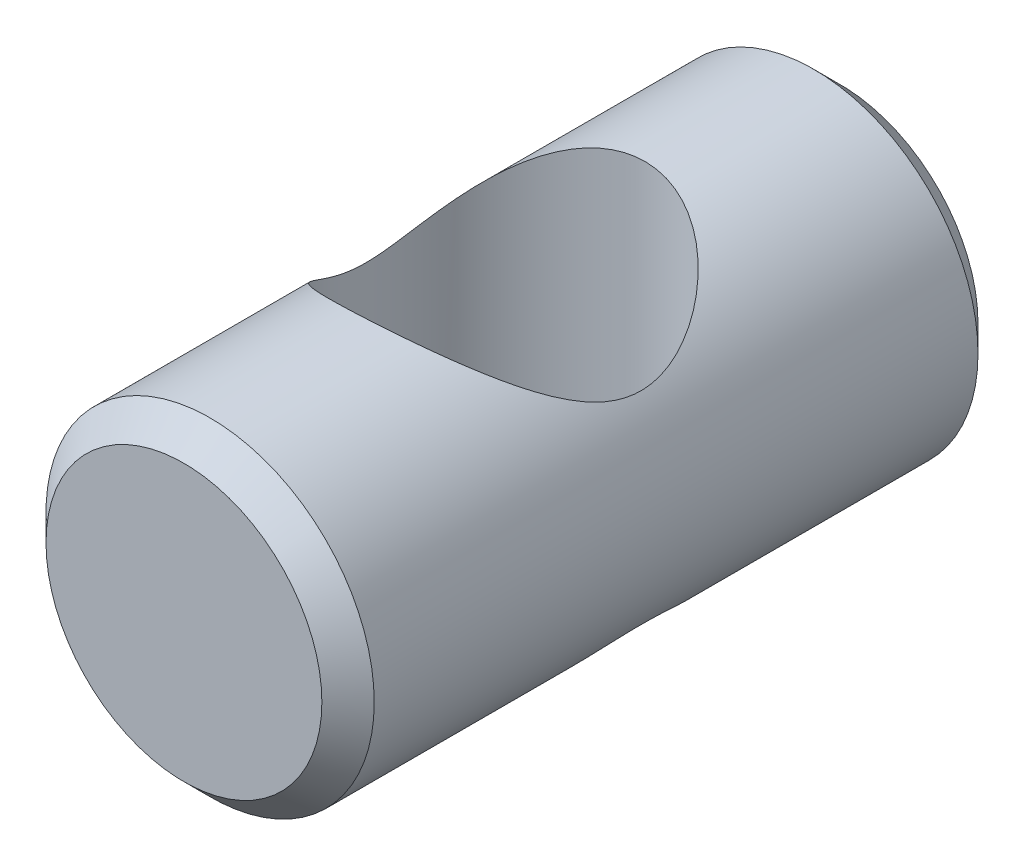
ISO-10303-21;
HEADER;
FILE_DESCRIPTION(('STEP AP214'),'2;1');
FILE_NAME('part.step','',(''),(''),'','','');
FILE_SCHEMA(('AUTOMOTIVE_DESIGN { 1 0 10303 214 1 1 1 1 }'));
ENDSEC;
DATA;
#1=APPLICATION_CONTEXT('core data for automotive mechanical design processes');
#2=APPLICATION_PROTOCOL_DEFINITION('international standard','automotive_design',2000,#1);
#3=PRODUCT_CONTEXT('',#1,'mechanical');
#4=PRODUCT('Part','Part','',(#3));
#5=PRODUCT_RELATED_PRODUCT_CATEGORY('part','',(#4));
#6=PRODUCT_DEFINITION_FORMATION('','',#4);
#7=PRODUCT_DEFINITION_CONTEXT('part definition',#1,'design');
#8=PRODUCT_DEFINITION('design','',#6,#7);
#9=PRODUCT_DEFINITION_SHAPE('','',#8);
#10=(LENGTH_UNIT() NAMED_UNIT(*) SI_UNIT(.MILLI.,.METRE.));
#11=(NAMED_UNIT(*) PLANE_ANGLE_UNIT() SI_UNIT($,.RADIAN.));
#12=(NAMED_UNIT(*) SI_UNIT($,.STERADIAN.) SOLID_ANGLE_UNIT());
#13=UNCERTAINTY_MEASURE_WITH_UNIT(LENGTH_MEASURE(1.E-05),#10,'distance_accuracy_value','');
#14=(GEOMETRIC_REPRESENTATION_CONTEXT(3) GLOBAL_UNCERTAINTY_ASSIGNED_CONTEXT((#13)) GLOBAL_UNIT_ASSIGNED_CONTEXT((#10,
#11,#12)) REPRESENTATION_CONTEXT('',''));
#15=CARTESIAN_POINT('',(0.,0.,0.));
#16=DIRECTION('',(0.,0.,1.));
#17=DIRECTION('',(1.,0.,0.));
#18=AXIS2_PLACEMENT_3D('',#15,#16,#17);
#19=CARTESIAN_POINT('',(0.,0.,9.525));
#20=DIRECTION('',(0.,0.,-1.));
#21=DIRECTION('',(-1.,0.,0.));
#22=AXIS2_PLACEMENT_3D('',#19,#20,#21);
#23=CYLINDRICAL_SURFACE('',#22,4.765);
#24=CARTESIAN_POINT('',(0.,-4.765,-3.99217985566783));
#25=CARTESIAN_POINT('',(-0.0932636342546237,-4.76499929685556,-3.99801953956757));
#26=CARTESIAN_POINT('',(-0.186746626324761,-4.76225587992272,-4.00058744573495));
#27=CARTESIAN_POINT('',(-0.373378545633254,-4.75126921844668,-3.99918661164055));
#28=CARTESIAN_POINT('',(-0.466527277697269,-4.74302316348069,-3.99521452961676));
#29=CARTESIAN_POINT('',(-0.651827972425573,-4.72112928459135,-3.98085197083435));
#30=CARTESIAN_POINT('',(-0.743978231756207,-4.7074733824887,-3.9704518824748));
#31=CARTESIAN_POINT('',(-0.92647593532388,-4.67498273941237,-3.94346225948741));
#32=CARTESIAN_POINT('',(-1.01682255283257,-4.65614567949148,-3.92686995219917));
#33=CARTESIAN_POINT('',(-1.19449183493765,-4.61375124749371,-3.88794952233966));
#34=CARTESIAN_POINT('',(-1.28183023187267,-4.59022506902588,-3.86565904281481));
#35=CARTESIAN_POINT('',(-1.45362173974024,-4.53875091504347,-3.81566600489297));
#36=CARTESIAN_POINT('',(-1.53807378716818,-4.51080133058981,-3.78796147636304));
#37=CARTESIAN_POINT('',(-1.78641383567682,-4.42096114353921,-3.69735690427841));
#38=CARTESIAN_POINT('',(-1.94543175511518,-4.35304329081578,-3.62693290874089));
#39=CARTESIAN_POINT('',(-2.30380451640421,-4.17741350012835,-3.44039707437933));
#40=CARTESIAN_POINT('',(-2.49667447952027,-4.06422801303888,-3.31699312897678));
#41=CARTESIAN_POINT('',(-2.76381181741647,-3.8830712430079,-3.11341573113442));
#42=CARTESIAN_POINT('',(-2.8492754907499,-3.82068612502346,-3.04235638115388));
#43=CARTESIAN_POINT('',(-3.01286512766343,-3.6930484581163,-2.89459974115908));
#44=CARTESIAN_POINT('',(-3.09099346555476,-3.62779684713207,-2.81790428987467));
#45=CARTESIAN_POINT('',(-3.24155101944227,-3.49398558877246,-2.6576258679043));
#46=CARTESIAN_POINT('',(-3.313824471458,-3.42538514803176,-2.5739314209996));
#47=CARTESIAN_POINT('',(-3.45087151066808,-3.28727366019987,-2.40136598261166));
#48=CARTESIAN_POINT('',(-3.5156468524533,-3.21776283039888,-2.31249620952354));
#49=CARTESIAN_POINT('',(-3.63770799140098,-3.0790946792254,-2.12967322939658));
#50=CARTESIAN_POINT('',(-3.695001351431,-3.00993706985463,-2.03572529342641));
#51=CARTESIAN_POINT('',(-3.80211687224711,-2.87343937308191,-1.84246198662627));
#52=CARTESIAN_POINT('',(-3.85194207105322,-2.8060985558074,-1.74314882084127));
#53=CARTESIAN_POINT('',(-3.95119517800654,-2.66492513869682,-1.52250650529235));
#54=CARTESIAN_POINT('',(-3.99932877587216,-2.59173667978181,-1.40017098870717));
#55=CARTESIAN_POINT('',(-4.08455770701651,-2.45521084972163,-1.14632971481291));
#56=CARTESIAN_POINT('',(-4.12165997592989,-2.39186730087765,-1.01482978384744));
#57=CARTESIAN_POINT('',(-4.17667849207109,-2.29413683913644,-0.77032943319409));
#58=CARTESIAN_POINT('',(-4.19698603169305,-2.25646351033573,-0.659227433665801));
#59=CARTESIAN_POINT('',(-4.2282884742733,-2.19725957629503,-0.431654967738876));
#60=CARTESIAN_POINT('',(-4.23931148038454,-2.17568027926007,-0.315201835356546));
#61=CARTESIAN_POINT('',(-4.25099603404465,-2.15278124463893,-0.0784809482425702));
#62=CARTESIAN_POINT('',(-4.25155342799019,-2.15166515917293,0.0418132279875593));
#63=CARTESIAN_POINT('',(-4.24195675176841,-2.17050845135498,0.280359395307959));
#64=CARTESIAN_POINT('',(-4.23178524644628,-2.19050213379165,0.398607743936912));
#65=CARTESIAN_POINT('',(-4.19825513172981,-2.25419755077492,0.657459710173462));
#66=CARTESIAN_POINT('',(-4.17229920322084,-2.30246865081475,0.796540923916213));
#67=CARTESIAN_POINT('',(-4.10807920158268,-2.4151826009121,1.06510156990961));
#68=CARTESIAN_POINT('',(-4.06976852369609,-2.47968647882197,1.19454232341063));
#69=CARTESIAN_POINT('',(-3.98601522639179,-2.61200165340933,1.43419443807786));
#70=CARTESIAN_POINT('',(-3.94142262237715,-2.67910014777304,1.54511107852799));
#71=CARTESIAN_POINT('',(-3.84371346339955,-2.81749481067995,1.76045879982678));
#72=CARTESIAN_POINT('',(-3.79059039517393,-2.88879416015316,1.86488483972058));
#73=CARTESIAN_POINT('',(-3.67598639221244,-3.03329424860508,2.06790143357886));
#74=CARTESIAN_POINT('',(-3.61449387085448,-3.10649750765333,2.16648362085392));
#75=CARTESIAN_POINT('',(-3.48325039204997,-3.25297781485761,2.35786944277051));
#76=CARTESIAN_POINT('',(-3.41350175312349,-3.32625483659505,2.45067468860063));
#77=CARTESIAN_POINT('',(-3.26080472031359,-3.47628728466866,2.63636742011279));
#78=CARTESIAN_POINT('',(-3.17729087693588,-3.55295601198909,2.72886182357702));
#79=CARTESIAN_POINT('',(-3.00063023192446,-3.70336473469613,2.90684681710094));
#80=CARTESIAN_POINT('',(-2.90748123235961,-3.77710405650594,2.9923358011076));
#81=CARTESIAN_POINT('',(-2.71173028204539,-3.91999683527538,3.15532014868628));
#82=CARTESIAN_POINT('',(-2.60915574803934,-3.9891626457682,3.23283738847382));
#83=CARTESIAN_POINT('',(-2.39444043296993,-4.12162802170452,3.3790928466628));
#84=CARTESIAN_POINT('',(-2.28230072868795,-4.18492824578615,3.44783205106556));
#85=CARTESIAN_POINT('',(-2.00708387624579,-4.32531195678045,3.59792880262123));
#86=CARTESIAN_POINT('',(-1.8400448188452,-4.39932361922773,3.67511755292219));
#87=CARTESIAN_POINT('',(-1.57834649321652,-4.49697235287117,3.77415259577446));
#88=CARTESIAN_POINT('',(-1.48923459808212,-4.5272994198286,3.80437811941918));
#89=CARTESIAN_POINT('',(-1.30770291626183,-4.58302662034325,3.85878559210083));
#90=CARTESIAN_POINT('',(-1.21528476319075,-4.60842914834178,3.88297047991306));
#91=CARTESIAN_POINT('',(-1.02692604453561,-4.6540430569794,3.92501915547262));
#92=CARTESIAN_POINT('',(-0.930962908485044,-4.67421043843836,3.9428298150059));
#93=CARTESIAN_POINT('',(-0.737002009159674,-4.70868852930462,3.97145208269209));
#94=CARTESIAN_POINT('',(-0.639005267288018,-4.72300210746424,3.98226712067922));
#95=CARTESIAN_POINT('',(-0.441801601954884,-4.74551184766624,3.99662148589615));
#96=CARTESIAN_POINT('',(-0.342594955976878,-4.75370938653063,4.00016245095548));
#97=CARTESIAN_POINT('',(-0.143881098687137,-4.76386599002772,3.99982611798257));
#98=CARTESIAN_POINT('',(-0.0443739186588217,-4.76582568299566,3.99594956717615));
#99=CARTESIAN_POINT('',(0.142601319844962,-4.76367488760205,3.98166000923224));
#100=CARTESIAN_POINT('',(0.230139663927012,-4.76023563527063,3.97204874882731));
#101=CARTESIAN_POINT('',(0.404095206882386,-4.74863633453285,3.94713752669736));
#102=CARTESIAN_POINT('',(0.490512044815661,-4.74047480305429,3.93183577836552));
#103=CARTESIAN_POINT('',(0.747125059008787,-4.70920634065063,3.87765618068095));
#104=CARTESIAN_POINT('',(0.914847520236653,-4.67931303119033,3.83049108297636));
#105=CARTESIAN_POINT('',(1.24212294869065,-4.60337990382,3.71540304092315));
#106=CARTESIAN_POINT('',(1.40150042512666,-4.55708733158365,3.64715743139954));
#107=CARTESIAN_POINT('',(1.70677269604494,-4.45177154387493,3.49289614723717));
#108=CARTESIAN_POINT('',(1.85266271807905,-4.39274384660379,3.40687421713155));
#109=CARTESIAN_POINT('',(2.18915745696832,-4.23794561030798,3.17924828832661));
#110=CARTESIAN_POINT('',(2.3721467545469,-4.13726698526423,3.02961945059424));
#111=CARTESIAN_POINT('',(2.623035922786,-3.97929534007322,2.78556581183073));
#112=CARTESIAN_POINT('',(2.7028792417831,-3.92535567931687,2.70074259403865));
#113=CARTESIAN_POINT('',(2.85459325731943,-3.81643994226184,2.52486999558882));
#114=CARTESIAN_POINT('',(2.92646724519662,-3.76146430488,2.43382321057071));
#115=CARTESIAN_POINT('',(3.06317911734919,-3.65102774584645,2.24426331421854));
#116=CARTESIAN_POINT('',(3.12789189999219,-3.59557234970936,2.1456569654534));
#117=CARTESIAN_POINT('',(3.24882151524593,-3.48668901429869,1.94222911514202));
#118=CARTESIAN_POINT('',(3.30503549413234,-3.43326176052369,1.83740554235624));
#119=CARTESIAN_POINT('',(3.40838410618299,-3.33067920198283,1.62186863871763));
#120=CARTESIAN_POINT('',(3.45554949313768,-3.28150975039353,1.51117695064001));
#121=CARTESIAN_POINT('',(3.54037501115689,-3.18980698862756,1.28366040396667));
#122=CARTESIAN_POINT('',(3.5780441070083,-3.14726743422372,1.1668414565304));
#123=CARTESIAN_POINT('',(3.64814965114855,-3.06587099413605,0.908322108013169));
#124=CARTESIAN_POINT('',(3.67882819124777,-3.02864871340586,0.765600256197071));
#125=CARTESIAN_POINT('',(3.72449410555849,-2.97232776750476,0.474358237270456));
#126=CARTESIAN_POINT('',(3.73951898417932,-2.95318579428961,0.325852817504354));
#127=CARTESIAN_POINT('',(3.75274148840374,-2.93637559438129,0.0259607635422211));
#128=CARTESIAN_POINT('',(3.75084476832033,-2.93882776397371,-0.125437322594934));
#129=CARTESIAN_POINT('',(3.73017661978895,-2.96500309963719,-0.425287492229992));
#130=CARTESIAN_POINT('',(3.71138031383829,-2.98875762429599,-0.573734902711168));
#131=CARTESIAN_POINT('',(3.65152271896217,-3.06175085297876,-0.901472958647738));
#132=CARTESIAN_POINT('',(3.60595080194968,-3.11600160720255,-1.0787760578486));
#133=CARTESIAN_POINT('',(3.49365442117246,-3.2413960807351,-1.42042411659735));
#134=CARTESIAN_POINT('',(3.42686384462841,-3.31259242257963,-1.58472654293495));
#135=CARTESIAN_POINT('',(3.29679559478011,-3.44124074215771,-1.85350304412674));
#136=CARTESIAN_POINT('',(3.2382614790395,-3.49657708741531,-1.96136167558924));
#137=CARTESIAN_POINT('',(3.11209270004812,-3.60932903386786,-2.17054437735947));
#138=CARTESIAN_POINT('',(3.04445439402694,-3.66674546058983,-2.27186580787049));
#139=CARTESIAN_POINT('',(2.90035007868133,-3.78175772998841,-2.46780668292897));
#140=CARTESIAN_POINT('',(2.82388912713526,-3.839353451633,-2.56242991765641));
#141=CARTESIAN_POINT('',(2.66221914118108,-3.95317605267761,-2.74478289160146));
#142=CARTESIAN_POINT('',(2.57700835864243,-4.0094026557543,-2.83251124708479));
#143=CARTESIAN_POINT('',(2.33677329418466,-4.15642496712074,-3.0579879320571));
#144=CARTESIAN_POINT('',(2.17374584376865,-4.24466619725767,-3.18908125437443));
#145=CARTESIAN_POINT('',(1.82419614507642,-4.40619271797231,-3.42669671450098));
#146=CARTESIAN_POINT('',(1.63770634909285,-4.47949830702031,-3.53325222674676));
#147=CARTESIAN_POINT('',(1.28011797844197,-4.5929147364465,-3.7000120526299));
#148=CARTESIAN_POINT('',(1.11250840852615,-4.63665241475381,-3.76513840525319));
#149=CARTESIAN_POINT('',(0.853418734453356,-4.68878292493938,-3.84586360663573));
#150=CARTESIAN_POINT('',(0.765839954281946,-4.70390790587259,-3.86993374570037));
#151=CARTESIAN_POINT('',(0.588598719639249,-4.72935218256618,-3.91216476438609));
#152=CARTESIAN_POINT('',(0.498937293708008,-4.73967379968741,-3.93032849716309));
#153=CARTESIAN_POINT('',(0.341089323310587,-4.75325936794163,-3.95667757036388));
#154=CARTESIAN_POINT('',(0.273221486548851,-4.75764920373837,-3.96622521479757));
#155=CARTESIAN_POINT('',(0.136942002996889,-4.7635201526144,-3.98183130377502));
#156=CARTESIAN_POINT('',(0.0685302207219283,-4.7650005166713,-3.98788884953458));
#157=CARTESIAN_POINT('',(0.,-4.765,-3.99217985566783));
#158=B_SPLINE_CURVE_WITH_KNOTS('',3,(#24,#25,#26,#27,#28,#29,#30,#31,#32,#33,#34,#35,#36,#37,
#38,#39,#40,#41,#42,#43,#44,#45,#46,#47,#48,#49,#50,#51,#52,#53,#54,#55,#56,#57,#58,#59,#60,#61,
#62,#63,#64,#65,#66,#67,#68,#69,#70,#71,#72,#73,#74,#75,#76,#77,#78,#79,#80,#81,#82,#83,#84,#85,
#86,#87,#88,#89,#90,#91,#92,#93,#94,#95,#96,#97,#98,#99,#100,#101,#102,#103,#104,#105,#106,#107,
#108,#109,#110,#111,#112,#113,#114,#115,#116,#117,#118,#119,#120,#121,#122,#123,#124,#125,#126,
#127,#128,#129,#130,#131,#132,#133,#134,#135,#136,#137,#138,#139,#140,#141,#142,#143,#144,#145,
#146,#147,#148,#149,#150,#151,#152,#153,#154,#155,#156,#157),.UNSPECIFIED.,.T.,.F.,(4,2,2,2,2,2,
2,2,2,2,2,2,2,2,2,2,2,2,2,2,2,2,2,2,2,2,2,2,2,2,2,2,2,2,2,2,2,2,2,2,2,2,2,2,2,2,2,2,2,2,2,2,2,2,
2,2,2,2,2,2,2,2,2,2,2,2,4),(0.,0.280265826861445,0.560674906639232,0.841504291286104,
1.12245957273513,1.40160473464658,1.68085166523384,2.23888909079667,3.00077725635895,
3.38287997126945,3.76485857716687,4.15492786307074,4.5449056857257,4.9344862120514,
5.32390782583272,5.77456067077657,6.22492957847529,6.58091540777701,6.93581979900076,
7.29425434128098,7.65327226155973,8.09924743224877,8.5469249908495,8.95763993355976,
9.36866997359288,9.78027494147721,10.1917645936129,10.6302174214189,11.0687704887338,
11.5060860161679,11.9433523784234,12.5356723506448,12.8319731662841,13.1281295492703,
13.4266998196923,13.7251235950143,14.0234801699009,14.3218066905205,14.5858743872524,
14.8500250617548,15.3778397270548,15.9141711264176,16.4506915825636,17.2170340148792,
17.6018633776267,17.9865332089459,18.3771144765845,18.7678266035234,19.1571863168469,
19.5461770746277,19.996418796461,20.4455792916556,20.897245621259,21.3495779293569,
21.9192403259633,22.4906953693511,22.8940908490988,23.2976482180078,23.7009753774066,
24.1043832749877,24.7827070696525,25.4601027384216,26.0127661488078,26.2887137242828,
26.5645278014728,26.7704144413039,26.9763540782173),.UNSPECIFIED.);
#159=CARTESIAN_POINT('',(0.,-4.765,-3.99217985566783));
#160=VERTEX_POINT('',#159);
#161=EDGE_CURVE('E10',#160,#160,#158,.T.);
#162=ORIENTED_EDGE('',*,*,#161,.T.);
#163=EDGE_LOOP('',(#162));
#164=FACE_BOUND('',#163,.T.);
#165=CARTESIAN_POINT('',(-0.25,4.75843724346555,4.));
#166=CARTESIAN_POINT('',(-0.34627465992084,4.75337975943751,4.00000064090504));
#167=CARTESIAN_POINT('',(-0.442387310668187,4.74539396220807,3.996518764775));
#168=CARTESIAN_POINT('',(-0.633502028508014,4.72368002268288,3.98272627911989));
#169=CARTESIAN_POINT('',(-0.72850365645028,4.70994968370328,3.9724130564415));
#170=CARTESIAN_POINT('',(-0.916702526039824,4.67696656303222,3.94519408254473));
#171=CARTESIAN_POINT('',(-1.00989742631419,4.6577070681138,3.9282803082389));
#172=CARTESIAN_POINT('',(-1.19371726954248,4.61402320678847,3.88822127388939));
#173=CARTESIAN_POINT('',(-1.28434098845932,4.58959642572554,3.86507309914442));
#174=CARTESIAN_POINT('',(-1.5501291100015,4.50957717649557,3.78728042140321));
#175=CARTESIAN_POINT('',(-1.72077564068079,4.44696165202984,3.72405073923505));
#176=CARTESIAN_POINT('',(-2.04661329479382,4.30676216337472,3.57828926640158));
#177=CARTESIAN_POINT('',(-2.20180353100751,4.22917734066973,3.49575636860523));
#178=CARTESIAN_POINT('',(-2.55671747619823,4.02807343448444,3.27699003598806));
#179=CARTESIAN_POINT('',(-2.74828306007134,3.89883442269683,3.1326696897264));
#180=CARTESIAN_POINT('',(-3.01055761233246,3.69515277123072,2.89710700638971));
#181=CARTESIAN_POINT('',(-3.09394580079139,3.62547157911947,2.81522169639595));
#182=CARTESIAN_POINT('',(-3.25246644763419,3.48395537277521,2.645498386816));
#183=CARTESIAN_POINT('',(-3.32760029938517,3.41212072466866,2.5576613959586));
#184=CARTESIAN_POINT('',(-3.47129287570058,3.26589972726585,2.37427049067649));
#185=CARTESIAN_POINT('',(-3.53966360660714,3.19149247163096,2.27858665519027));
#186=CARTESIAN_POINT('',(-3.66794394215212,3.04319223724461,2.08122996667882));
#187=CARTESIAN_POINT('',(-3.72784965149316,2.96929951003353,1.97955438676688));
#188=CARTESIAN_POINT('',(-3.83892379551144,2.82421753160467,1.77020735508714));
#189=CARTESIAN_POINT('',(-3.89011724847585,2.75302101188115,1.66255429093986));
#190=CARTESIAN_POINT('',(-3.98361705727386,2.61589024926147,1.44035440832748));
#191=CARTESIAN_POINT('',(-4.02593327931368,2.54995021537623,1.32581542709954));
#192=CARTESIAN_POINT('',(-4.09728703657317,2.4334463522119,1.10042903404067));
#193=CARTESIAN_POINT('',(-4.12722201203197,2.38200770830041,0.990329487631318));
#194=CARTESIAN_POINT('',(-4.17821787470173,2.29138166875942,0.763269207930586));
#195=CARTESIAN_POINT('',(-4.19929711705935,2.2521689765462,0.646323244456671));
#196=CARTESIAN_POINT('',(-4.2288253335911,2.19616421008226,0.423814054748796));
#197=CARTESIAN_POINT('',(-4.23866674992353,2.17693839901142,0.319073874900625));
#198=CARTESIAN_POINT('',(-4.24995388358446,2.15483025598569,0.107470933018347));
#199=CARTESIAN_POINT('',(-4.25141075426384,2.15192621249184,0.000611180578691213));
#200=CARTESIAN_POINT('',(-4.24579931100861,2.16296905073794,-0.211872048149847));
#201=CARTESIAN_POINT('',(-4.23873773472566,2.17690261481505,-0.317496434864719));
#202=CARTESIAN_POINT('',(-4.21677440735029,2.2191426956382,-0.525015715375955));
#203=CARTESIAN_POINT('',(-4.2018577564571,2.24747652377266,-0.626903126518766));
#204=CARTESIAN_POINT('',(-4.15293665954614,2.33715799531474,-0.891904410345845));
#205=CARTESIAN_POINT('',(-4.11283562656993,2.40792816186499,-1.05064914098815));
#206=CARTESIAN_POINT('',(-4.04090286375969,2.52557172047843,-1.27885009306609));
#207=CARTESIAN_POINT('',(-4.01488107845955,2.56681966037105,-1.35343992925239));
#208=CARTESIAN_POINT('',(-3.95908693709358,2.65206279668428,-1.49959391386634));
#209=CARTESIAN_POINT('',(-3.9293156893634,2.69605717933017,-1.57115894810576));
#210=CARTESIAN_POINT('',(-3.84365607932113,2.8178642431166,-1.76154511585717));
#211=CARTESIAN_POINT('',(-3.78428071051058,2.8974244921385,-1.87767935329263));
#212=CARTESIAN_POINT('',(-3.65524648091415,3.05860902074752,-2.10264253641082));
#213=CARTESIAN_POINT('',(-3.58558102511783,3.14023459601011,-2.21146673146299));
#214=CARTESIAN_POINT('',(-3.43604155076692,3.303189680786,-2.4219379562844));
#215=CARTESIAN_POINT('',(-3.35617579082569,3.38451937566622,-2.52359069014903));
#216=CARTESIAN_POINT('',(-3.18613367578069,3.54506119118226,-2.71954733160134));
#217=CARTESIAN_POINT('',(-3.0959620354966,3.62427425984779,-2.81385456672749));
#218=CARTESIAN_POINT('',(-2.85001595862574,3.82362742932879,-3.04678340463435));
#219=CARTESIAN_POINT('',(-2.68637932163794,3.94104969375965,-3.17962738650602));
#220=CARTESIAN_POINT('',(-2.33309771565886,4.15992250133354,-3.42145795709655));
#221=CARTESIAN_POINT('',(-2.14350114874585,4.26140203065883,-3.53048798728598));
#222=CARTESIAN_POINT('',(-1.78034877835455,4.42342953481607,-3.6999535158214));
#223=CARTESIAN_POINT('',(-1.61119154806348,4.48810475431538,-3.76574860614816));
#224=CARTESIAN_POINT('',(-1.3479332990087,4.57130299241881,-3.84746899939421));
#225=CARTESIAN_POINT('',(-1.2585665650257,4.59673860242333,-3.87188497572809));
#226=CARTESIAN_POINT('',(-1.0771517707338,4.64259686443313,-3.91465072398747));
#227=CARTESIAN_POINT('',(-0.985104880593632,4.66302166852781,-3.93300310134463));
#228=CARTESIAN_POINT('',(-0.79831975616411,4.69861798385104,-3.9633771838394));
#229=CARTESIAN_POINT('',(-0.703567733560013,4.71375380248022,-3.97535615101544));
#230=CARTESIAN_POINT('',(-0.512754515747438,4.73830735834007,-3.99250946263296));
#231=CARTESIAN_POINT('',(-0.416693925196343,4.74772765067709,-3.99768684890576));
#232=CARTESIAN_POINT('',(-0.224053403473667,4.76070770231354,-4.00107494244159));
#233=CARTESIAN_POINT('',(-0.127473506398432,4.76426784177351,-3.99928610164387));
#234=CARTESIAN_POINT('',(0.0653108697711223,4.76552941755137,-3.98872356539716));
#235=CARTESIAN_POINT('',(0.161515374963457,4.76323126868879,-3.97995036453395));
#236=CARTESIAN_POINT('',(0.429496277499973,4.74873006465728,-3.94567816183399));
#237=CARTESIAN_POINT('',(0.600024517199027,4.73006321574309,-3.91240877824167));
#238=CARTESIAN_POINT('',(0.932710717739463,4.67587229075447,-3.82503185241182));
#239=CARTESIAN_POINT('',(1.09486645735113,4.64034376648761,-3.77091881222579));
#240=CARTESIAN_POINT('',(1.41557999993905,4.55305730944743,-3.64105007302511));
#241=CARTESIAN_POINT('',(1.57355484343883,4.50057821809412,-3.5643494323036));
#242=CARTESIAN_POINT('',(1.87476627330075,4.38367647692629,-3.39343472442461));
#243=CARTESIAN_POINT('',(2.01800140209067,4.31925264768906,-3.29921892781923));
#244=CARTESIAN_POINT('',(2.31387040958301,4.16936165633887,-3.07683030737472));
#245=CARTESIAN_POINT('',(2.46333910083244,4.08220649438385,-2.94560000518553));
#246=CARTESIAN_POINT('',(2.74002211077138,3.90189847378619,-2.66436179502179));
#247=CARTESIAN_POINT('',(2.86717908671495,3.80873097893388,-2.51430715479735));
#248=CARTESIAN_POINT('',(3.05309114897676,3.65951069049002,-2.25916693622253));
#249=CARTESIAN_POINT('',(3.11914273314451,3.60319966763547,-2.15945936408954));
#250=CARTESIAN_POINT('',(3.24253068670825,3.49257451867627,-1.95362194906918));
#251=CARTESIAN_POINT('',(3.2998630611348,3.43826131652214,-1.84748919323888));
#252=CARTESIAN_POINT('',(3.40523470339531,3.33392917171794,-1.62908474234014));
#253=CARTESIAN_POINT('',(3.45329907177569,3.28389884035372,-1.51683071557005));
#254=CARTESIAN_POINT('',(3.53963900203655,3.19064493545243,-1.28600339284153));
#255=CARTESIAN_POINT('',(3.57792452615421,3.14741445193658,-1.16743667801894));
#256=CARTESIAN_POINT('',(3.64843826212001,3.06552644276119,-0.907080571739073));
#257=CARTESIAN_POINT('',(3.67906832377435,3.02835618048747,-0.764363752763215));
#258=CARTESIAN_POINT('',(3.72463435396844,2.97215099792122,-0.473167828768642));
#259=CARTESIAN_POINT('',(3.73961064273783,2.95306949734237,-0.324704554381361));
#260=CARTESIAN_POINT('',(3.75274658802815,2.93636880082835,-0.0249040341882249));
#261=CARTESIAN_POINT('',(3.75081114698758,2.93887097258069,0.126444682372085));
#262=CARTESIAN_POINT('',(3.73007788691388,2.96512759906693,0.426194852840394));
#263=CARTESIAN_POINT('',(3.71125444038629,2.9889143529413,0.574591477000311));
#264=CARTESIAN_POINT('',(3.6513276928063,3.06198467788289,0.902328475331606));
#265=CARTESIAN_POINT('',(3.60570186711034,3.11629177759942,1.07967436360577));
#266=CARTESIAN_POINT('',(3.49328843609878,3.24179255366017,1.42139489293831));
#267=CARTESIAN_POINT('',(3.42643494986667,3.3130386255014,1.58572713480459));
#268=CARTESIAN_POINT('',(3.29626436856903,3.44175042653383,1.85451962881735));
#269=CARTESIAN_POINT('',(3.23769562754517,3.49710188014904,1.96236825153308));
#270=CARTESIAN_POINT('',(3.11145674099639,3.60987808361638,2.17152964776801));
#271=CARTESIAN_POINT('',(3.04378295742635,3.66730365546673,2.2728397846787));
#272=CARTESIAN_POINT('',(2.89960444723238,3.78233030580161,2.46875897146219));
#273=CARTESIAN_POINT('',(2.82310453805714,3.83993127199291,2.56337163185138));
#274=CARTESIAN_POINT('',(2.66135476745776,3.95375887667293,2.74570049267473));
#275=CARTESIAN_POINT('',(2.57610315785917,4.0099852377927,2.83341530904307));
#276=CARTESIAN_POINT('',(2.33580272507686,4.15697054280164,3.05880653465497));
#277=CARTESIAN_POINT('',(2.1727565401097,4.24517224445871,3.18983082562772));
#278=CARTESIAN_POINT('',(1.82320816087493,4.40660018917108,3.4272910340576));
#279=CARTESIAN_POINT('',(1.63674181722378,4.47984888108339,3.53376384210405));
#280=CARTESIAN_POINT('',(1.27812738863083,4.59350930157674,3.70088943237953));
#281=CARTESIAN_POINT('',(1.1093719710405,4.63744948462555,3.76632970538242));
#282=CARTESIAN_POINT('',(0.84843176686246,4.68969995832505,3.84730609016714));
#283=CARTESIAN_POINT('',(0.760186940576753,4.70483686161144,3.87142807035924));
#284=CARTESIAN_POINT('',(0.581595100740546,4.73023181656353,3.91367558468328));
#285=CARTESIAN_POINT('',(0.491248768100426,4.74049142604896,3.93180303291974));
#286=CARTESIAN_POINT('',(0.293054815163994,4.75719382369709,3.96445094645018));
#287=CARTESIAN_POINT('',(0.184923263713776,4.76264823099485,3.97777665522621));
#288=CARTESIAN_POINT('',(-0.0322077266319243,4.76612807893754,3.99555153489534));
#289=CARTESIAN_POINT('',(-0.14120730250681,4.76415232291003,3.99999927576178));
#290=CARTESIAN_POINT('',(-0.25,4.75843724346555,4.));
#291=B_SPLINE_CURVE_WITH_KNOTS('',3,(#165,#166,#167,#168,#169,#170,#171,#172,#173,#174,#175,
#176,#177,#178,#179,#180,#181,#182,#183,#184,#185,#186,#187,#188,#189,#190,#191,#192,#193,#194,
#195,#196,#197,#198,#199,#200,#201,#202,#203,#204,#205,#206,#207,#208,#209,#210,#211,#212,#213,
#214,#215,#216,#217,#218,#219,#220,#221,#222,#223,#224,#225,#226,#227,#228,#229,#230,#231,#232,
#233,#234,#235,#236,#237,#238,#239,#240,#241,#242,#243,#244,#245,#246,#247,#248,#249,#250,#251,
#252,#253,#254,#255,#256,#257,#258,#259,#260,#261,#262,#263,#264,#265,#266,#267,#268,#269,#270,
#271,#272,#273,#274,#275,#276,#277,#278,#279,#280,#281,#282,#283,#284,#285,#286,#287,#288,#289,
#290),.UNSPECIFIED.,.T.,.F.,(4,2,2,2,2,2,2,2,2,2,2,2,2,2,2,2,2,2,2,2,2,2,2,2,2,2,2,2,2,2,2,2,2,
2,2,2,2,2,2,2,2,2,2,2,2,2,2,2,2,2,2,2,2,2,2,2,2,2,2,2,2,2,4),(0.,0.289102734592412,
0.578316121803985,0.867882153503534,1.15758379856276,1.73222501978116,2.30689920748663,
3.1194611094955,3.52738643142066,3.93524278766983,4.35235840410654,4.76966534135464,
5.18575293506752,5.60137560753134,5.97605506066589,6.34995404342222,6.66939365927852,
6.98840824946942,7.30717068095035,7.62653994258005,8.15840827179156,8.42569452986046,
8.69290196312974,9.15062366343806,9.6086400049812,10.0662878397265,10.5237271377364,
11.2447497117665,11.9644458009958,12.5399278355537,12.8278335507255,13.1156153960359,
13.405303435385,13.6948618750893,13.984401529784,14.2739206830354,14.7955521468059,
15.3173212960632,15.8651175723339,16.4129679668095,17.0621924694478,17.7130618362497,
18.1092578733456,18.5056348962489,18.9009228501391,19.2958064820137,19.7459674719579,
20.194966080064,20.6464911022427,21.0987024733013,21.6685694586431,22.2402226264302,
22.6436579483775,23.0472549498569,23.4506326942304,23.8540911717034,24.5322889207172,
25.2094608840597,25.7656638760586,26.0435457798117,26.3213388676636,26.6479793501879,
26.9746724423767),.UNSPECIFIED.);
#292=CARTESIAN_POINT('',(-0.25,4.75843724346555,4.));
#293=VERTEX_POINT('',#292);
#294=EDGE_CURVE('E46',#293,#293,#291,.T.);
#295=ORIENTED_EDGE('',*,*,#294,.T.);
#296=EDGE_LOOP('',(#295));
#297=FACE_BOUND('',#296,.T.);
#298=CARTESIAN_POINT('',(0.,0.,-8.76499999999999));
#299=DIRECTION('',(0.,0.,1.));
#300=DIRECTION('',(1.,0.,0.));
#301=AXIS2_PLACEMENT_3D('',#298,#299,#300);
#302=CIRCLE('',#301,4.765);
#303=CARTESIAN_POINT('',(4.765,0.,-8.76499999999999));
#304=VERTEX_POINT('',#303);
#305=EDGE_CURVE('E87',#304,#304,#302,.T.);
#306=ORIENTED_EDGE('',*,*,#305,.T.);
#307=EDGE_LOOP('',(#306));
#308=FACE_BOUND('',#307,.T.);
#309=CARTESIAN_POINT('',(0.,0.,8.76500000000001));
#310=DIRECTION('',(0.,0.,1.));
#311=DIRECTION('',(1.,0.,0.));
#312=AXIS2_PLACEMENT_3D('',#309,#310,#311);
#313=CIRCLE('',#312,4.765);
#314=CARTESIAN_POINT('',(4.765,0.,8.76500000000001));
#315=VERTEX_POINT('',#314);
#316=EDGE_CURVE('E90',#315,#315,#313,.F.);
#317=ORIENTED_EDGE('',*,*,#316,.T.);
#318=EDGE_LOOP('',(#317));
#319=FACE_BOUND('',#318,.T.);
#320=ADVANCED_FACE('F33',(#164,#297,#308,#319),#23,.T.);
#321=CARTESIAN_POINT('',(0.,0.,9.525));
#322=DIRECTION('',(0.,0.,1.));
#323=DIRECTION('',(1.,0.,0.));
#324=AXIS2_PLACEMENT_3D('',#321,#322,#323);
#325=PLANE('',#324);
#326=CARTESIAN_POINT('',(0.,0.,9.525));
#327=DIRECTION('',(0.,0.,1.));
#328=DIRECTION('',(1.,0.,0.));
#329=AXIS2_PLACEMENT_3D('',#326,#327,#328);
#330=CIRCLE('',#329,4.00500000000001);
#331=CARTESIAN_POINT('',(4.00500000000001,0.,9.525));
#332=VERTEX_POINT('',#331);
#333=EDGE_CURVE('E50',#332,#332,#330,.T.);
#334=ORIENTED_EDGE('',*,*,#333,.T.);
#335=EDGE_LOOP('',(#334));
#336=FACE_BOUND('',#335,.T.);
#337=ADVANCED_FACE('F67',(#336),#325,.T.);
#338=CARTESIAN_POINT('',(0.,0.,-9.525));
#339=DIRECTION('',(0.,0.,1.));
#340=DIRECTION('',(1.,0.,0.));
#341=AXIS2_PLACEMENT_3D('',#338,#339,#340);
#342=PLANE('',#341);
#343=CARTESIAN_POINT('',(0.,0.,-9.525));
#344=DIRECTION('',(0.,0.,1.));
#345=DIRECTION('',(1.,0.,0.));
#346=AXIS2_PLACEMENT_3D('',#343,#344,#345);
#347=CIRCLE('',#346,4.00499999999998);
#348=CARTESIAN_POINT('',(4.00499999999998,0.,-9.525));
#349=VERTEX_POINT('',#348);
#350=EDGE_CURVE('E54',#349,#349,#347,.F.);
#351=ORIENTED_EDGE('',*,*,#350,.T.);
#352=EDGE_LOOP('',(#351));
#353=FACE_BOUND('',#352,.T.);
#354=ADVANCED_FACE('F70',(#353),#342,.F.);
#355=CARTESIAN_POINT('',(0.,0.,-8.76499999999999));
#356=DIRECTION('',(0.,0.,1.));
#357=DIRECTION('',(1.,0.,0.));
#358=AXIS2_PLACEMENT_3D('',#355,#356,#357);
#359=CONICAL_SURFACE('',#358,4.765,0.78539816339745);
#360=ORIENTED_EDGE('',*,*,#350,.F.);
#361=EDGE_LOOP('',(#360));
#362=FACE_BOUND('',#361,.T.);
#363=ORIENTED_EDGE('',*,*,#305,.F.);
#364=EDGE_LOOP('',(#363));
#365=FACE_BOUND('',#364,.T.);
#366=ADVANCED_FACE('F73',(#362,#365),#359,.T.);
#367=CARTESIAN_POINT('',(0.,0.,9.525));
#368=DIRECTION('',(0.,0.,-1.));
#369=DIRECTION('',(-1.,0.,0.));
#370=AXIS2_PLACEMENT_3D('',#367,#368,#369);
#371=CONICAL_SURFACE('',#370,4.00500000000001,0.785398163397449);
#372=ORIENTED_EDGE('',*,*,#316,.F.);
#373=EDGE_LOOP('',(#372));
#374=FACE_BOUND('',#373,.T.);
#375=ORIENTED_EDGE('',*,*,#333,.F.);
#376=EDGE_LOOP('',(#375));
#377=FACE_BOUND('',#376,.T.);
#378=ADVANCED_FACE('F36',(#374,#377),#371,.T.);
#379=CARTESIAN_POINT('',(-0.25,-4.765,0.));
#380=DIRECTION('',(0.,1.,0.));
#381=DIRECTION('',(0.,0.,1.));
#382=AXIS2_PLACEMENT_3D('',#379,#380,#381);
#383=CYLINDRICAL_SURFACE('',#382,4.);
#384=ORIENTED_EDGE('',*,*,#294,.F.);
#385=EDGE_LOOP('',(#384));
#386=FACE_BOUND('',#385,.T.);
#387=ORIENTED_EDGE('',*,*,#161,.F.);
#388=EDGE_LOOP('',(#387));
#389=FACE_BOUND('',#388,.T.);
#390=ADVANCED_FACE('F62',(#386,#389),#383,.F.);
#391=CLOSED_SHELL('',(#320,#337,#354,#366,#378,#390));
#392=MANIFOLD_SOLID_BREP('B2',#391);
#393=ADVANCED_BREP_SHAPE_REPRESENTATION('',(#18,#392),#14);
#394=SHAPE_DEFINITION_REPRESENTATION(#9,#393);
ENDSEC;
END-ISO-10303-21;
